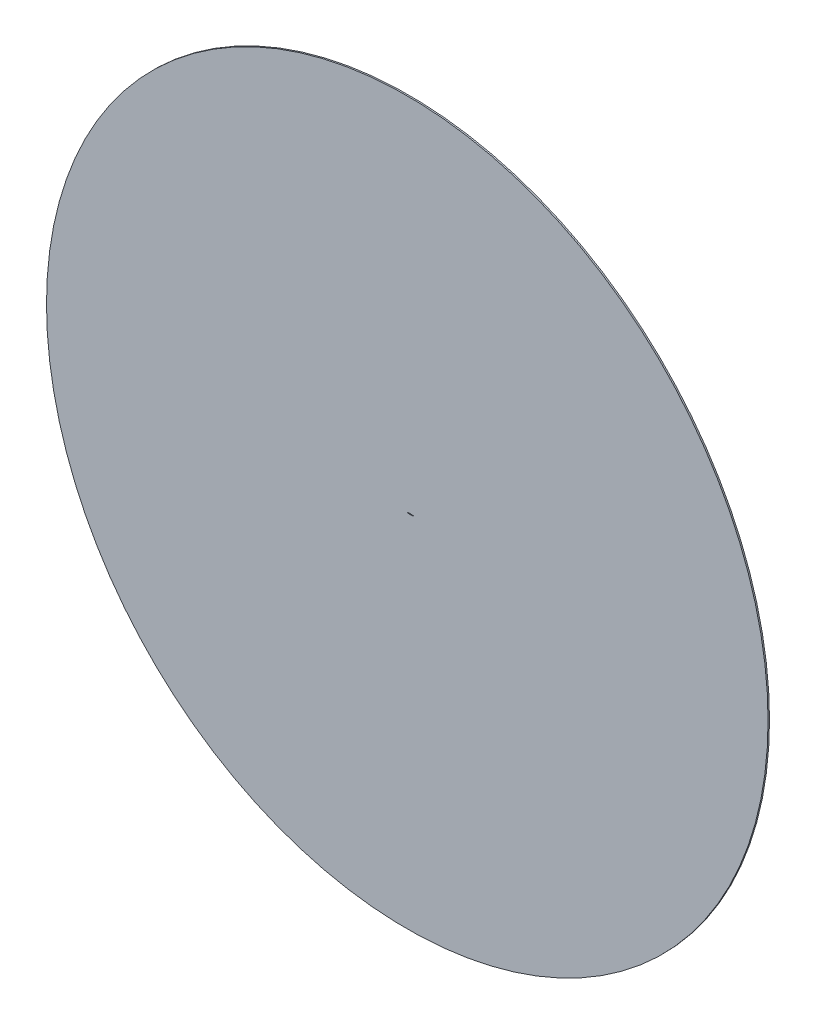
ISO-10303-21;
HEADER;
FILE_DESCRIPTION(('STEP AP214'),'2;1');
FILE_NAME('part.step','',(''),(''),'','','');
FILE_SCHEMA(('AUTOMOTIVE_DESIGN { 1 0 10303 214 1 1 1 1 }'));
ENDSEC;
DATA;
#1=APPLICATION_CONTEXT('core data for automotive mechanical design processes');
#2=APPLICATION_PROTOCOL_DEFINITION('international standard','automotive_design',2000,#1);
#3=PRODUCT_CONTEXT('',#1,'mechanical');
#4=PRODUCT('Part','Part','',(#3));
#5=PRODUCT_RELATED_PRODUCT_CATEGORY('part','',(#4));
#6=PRODUCT_DEFINITION_FORMATION('','',#4);
#7=PRODUCT_DEFINITION_CONTEXT('part definition',#1,'design');
#8=PRODUCT_DEFINITION('design','',#6,#7);
#9=PRODUCT_DEFINITION_SHAPE('','',#8);
#10=(LENGTH_UNIT() NAMED_UNIT(*) SI_UNIT(.MILLI.,.METRE.));
#11=(NAMED_UNIT(*) PLANE_ANGLE_UNIT() SI_UNIT($,.RADIAN.));
#12=(NAMED_UNIT(*) SI_UNIT($,.STERADIAN.) SOLID_ANGLE_UNIT());
#13=UNCERTAINTY_MEASURE_WITH_UNIT(LENGTH_MEASURE(1.E-05),#10,'distance_accuracy_value','');
#14=(GEOMETRIC_REPRESENTATION_CONTEXT(3) GLOBAL_UNCERTAINTY_ASSIGNED_CONTEXT((#13)) GLOBAL_UNIT_ASSIGNED_CONTEXT((#10,
#11,#12)) REPRESENTATION_CONTEXT('',''));
#15=CARTESIAN_POINT('',(0.,0.,0.));
#16=DIRECTION('',(0.,0.,1.));
#17=DIRECTION('',(1.,0.,0.));
#18=AXIS2_PLACEMENT_3D('',#15,#16,#17);
#19=CARTESIAN_POINT('',(0.,0.,121.92));
#20=DIRECTION('',(0.,0.,1.));
#21=DIRECTION('',(1.,0.,0.));
#22=AXIS2_PLACEMENT_3D('',#19,#20,#21);
#23=PLANE('',#22);
#24=CARTESIAN_POINT('',(0.,0.,121.92));
#25=DIRECTION('',(0.,0.,1.));
#26=DIRECTION('',(1.,0.,0.));
#27=AXIS2_PLACEMENT_3D('',#24,#25,#26);
#28=CIRCLE('',#27,30480.);
#29=CARTESIAN_POINT('',(30480.,0.,121.92));
#30=VERTEX_POINT('',#29);
#31=EDGE_CURVE('E10',#30,#30,#28,.T.);
#32=ORIENTED_EDGE('',*,*,#31,.T.);
#33=EDGE_LOOP('',(#32));
#34=FACE_BOUND('',#33,.T.);
#35=CARTESIAN_POINT('',(609.6,0.,121.92));
#36=CARTESIAN_POINT('',(609.6,0.0130104566012491,121.92));
#37=CARTESIAN_POINT('',(609.026600723997,0.0649900751815312,121.92));
#38=CARTESIAN_POINT('',(608.434767900426,0.181226431540429,121.92));
#39=CARTESIAN_POINT('',(606.982031384372,0.374460392824656,121.92));
#40=CARTESIAN_POINT('',(605.170832321289,0.642870250711353,121.92));
#41=CARTESIAN_POINT('',(602.759875483166,0.986789867111129,121.92));
#42=CARTESIAN_POINT('',(599.853785309487,1.40274777429213,121.92));
#43=CARTESIAN_POINT('',(596.420052816498,1.88937961615334,121.92));
#44=CARTESIAN_POINT('',(592.478157132741,2.4453079871152,121.92));
#45=CARTESIAN_POINT('',(588.030463539284,3.06578899853619,121.92));
#46=CARTESIAN_POINT('',(583.086436220917,3.74967155816345,121.92));
#47=CARTESIAN_POINT('',(577.653844904966,4.4919089177736,121.92));
#48=CARTESIAN_POINT('',(571.742714485225,5.29146686524034,121.92));
#49=CARTESIAN_POINT('',(565.363317871176,6.14306525855016,121.92));
#50=CARTESIAN_POINT('',(558.526733426889,7.04351782345002,121.92));
#51=CARTESIAN_POINT('',(551.245154967076,7.98902076977611,121.92));
#52=CARTESIAN_POINT('',(543.531080963299,8.97511952413738,121.92));
#53=CARTESIAN_POINT('',(535.39834803518,9.9995052893117,121.92));
#54=CARTESIAN_POINT('',(526.860963094166,11.0564114791133,121.92));
#55=CARTESIAN_POINT('',(517.933767222701,12.1417835399762,121.92));
#56=CARTESIAN_POINT('',(508.633058212342,13.2534094939068,121.92));
#57=CARTESIAN_POINT('',(498.974520358023,14.3843378403688,121.92));
#58=CARTESIAN_POINT('',(488.975527473465,15.5328714696014,121.92));
#59=CARTESIAN_POINT('',(478.653256963089,16.6941764315264,121.92));
#60=CARTESIAN_POINT('',(468.025945058456,17.8633209757008,121.92));
#61=CARTESIAN_POINT('',(457.112240421421,19.0357667581051,121.92));
#62=CARTESIAN_POINT('',(445.931699122296,20.2096465833874,121.92));
#63=CARTESIAN_POINT('',(434.503313508911,21.3779421217635,121.92));
#64=CARTESIAN_POINT('',(422.847428321855,22.5381760746275,121.92));
#65=CARTESIAN_POINT('',(410.984273272549,23.6850482456446,121.92));
#66=CARTESIAN_POINT('',(398.934895517607,24.8131329223037,121.92));
#67=CARTESIAN_POINT('',(386.720444937814,25.9201631685775,121.92));
#68=CARTESIAN_POINT('',(374.362426443742,26.9990803855691,121.92));
#69=CARTESIAN_POINT('',(361.882333772255,28.0467784576064,121.92));
#70=CARTESIAN_POINT('',(349.302073434196,29.0580285456167,121.92));
#71=CARTESIAN_POINT('',(336.643533947729,30.0270333272432,121.92));
#72=CARTESIAN_POINT('',(323.9291152049,30.9493427134248,121.92));
#73=CARTESIAN_POINT('',(311.181344963931,31.8197227295067,121.92));
#74=CARTESIAN_POINT('',(298.422443522885,32.6341208846026,121.92));
#75=CARTESIAN_POINT('',(285.674590522553,33.384881258023,121.92));
#76=CARTESIAN_POINT('',(272.960120626968,34.0700560065496,121.92));
#77=CARTESIAN_POINT('',(260.30148774547,34.6832866793711,121.92));
#78=CARTESIAN_POINT('',(247.721025079832,35.2189817259111,121.92));
#79=CARTESIAN_POINT('',(235.240711112134,35.6732572044504,121.92));
#80=CARTESIAN_POINT('',(222.882477127997,36.0416368936221,121.92));
#81=CARTESIAN_POINT('',(210.667656569876,36.320169071557,121.92));
#82=CARTESIAN_POINT('',(198.617970937838,36.503920400923,121.92));
#83=CARTESIAN_POINT('',(186.754363143061,36.5908239041067,121.92));
#84=CARTESIAN_POINT('',(175.097954029079,36.575990554921,121.92));
#85=CARTESIAN_POINT('',(163.669045978673,36.459131780211,121.92));
#86=CARTESIAN_POINT('',(152.487788738099,36.2354072011975,121.92));
#87=CARTESIAN_POINT('',(141.573400808221,35.9062635973763,121.92));
#88=CARTESIAN_POINT('',(130.945292405559,35.4671408213348,121.92));
#89=CARTESIAN_POINT('',(120.622029775135,34.9204733380291,121.92));
#90=CARTESIAN_POINT('',(110.621959439198,34.2646057590174,121.92));
#91=CARTESIAN_POINT('',(100.962368246656,33.5002317368583,121.92));
#92=CARTESIAN_POINT('',(91.6601765134049,32.6299789601301,121.92));
#93=CARTESIAN_POINT('',(82.7315541808493,31.6540872878467,121.92));
#94=CARTESIAN_POINT('',(74.1924558830278,30.5756572634052,121.92));
#95=CARTESIAN_POINT('',(66.0575554192351,29.3979394260596,121.92));
#96=CARTESIAN_POINT('',(58.3413184983066,28.1223671881776,121.92));
#97=CARTESIAN_POINT('',(51.0568704189698,26.7548476483737,121.92));
#98=CARTESIAN_POINT('',(44.2170555487253,25.2975481822851,121.92));
#99=CARTESIAN_POINT('',(37.8335029017729,23.7561629133211,121.92));
#100=CARTESIAN_POINT('',(31.9176386513932,22.132931949737,121.92));
#101=CARTESIAN_POINT('',(26.4786305763954,20.4359071090879,121.92));
#102=CARTESIAN_POINT('',(21.5266730137156,18.6661929980101,121.92));
#103=CARTESIAN_POINT('',(17.0689192146321,16.8300633899347,121.92));
#104=CARTESIAN_POINT('',(13.1127046795349,14.9307183485392,121.92));
#105=CARTESIAN_POINT('',(9.6631338936738,12.9729796602536,121.92));
#106=CARTESIAN_POINT('',(6.72559364830512,10.9577256716238,121.92));
#107=CARTESIAN_POINT('',(4.30291585610377,8.88622488664342,121.92));
#108=CARTESIAN_POINT('',(2.39983378850914,6.75579353137347,121.92));
#109=CARTESIAN_POINT('',(1.02186515950936,4.5626304378332,121.92));
#110=CARTESIAN_POINT('',(0.185865427159036,2.30280920654648,121.92));
#111=CARTESIAN_POINT('',(-0.09124321605147,0.,121.92));
#112=CARTESIAN_POINT('',(0.185865427159039,-2.30280920654643,121.92));
#113=CARTESIAN_POINT('',(1.02186515950929,-4.56263043783308,121.92));
#114=CARTESIAN_POINT('',(2.39983378850923,-6.75579353137359,121.92));
#115=CARTESIAN_POINT('',(4.30291585610369,-8.88622488664333,121.92));
#116=CARTESIAN_POINT('',(6.72559364830521,-10.9577256716239,121.92));
#117=CARTESIAN_POINT('',(9.6631338936737,-12.9729796602536,121.92));
#118=CARTESIAN_POINT('',(13.112704679535,-14.9307183485392,121.92));
#119=CARTESIAN_POINT('',(17.068919214632,-16.8300633899347,121.92));
#120=CARTESIAN_POINT('',(21.5266730137157,-18.6661929980102,121.92));
#121=CARTESIAN_POINT('',(26.4786305763953,-20.4359071090879,121.92));
#122=CARTESIAN_POINT('',(31.9176386513933,-22.132931949737,121.92));
#123=CARTESIAN_POINT('',(37.8335029017728,-23.7561629133211,121.92));
#124=CARTESIAN_POINT('',(44.2170555487254,-25.2975481822852,121.92));
#125=CARTESIAN_POINT('',(51.0568704189697,-26.7548476483737,121.92));
#126=CARTESIAN_POINT('',(58.3413184983068,-28.1223671881776,121.92));
#127=CARTESIAN_POINT('',(66.0575554192349,-29.3979394260595,121.92));
#128=CARTESIAN_POINT('',(74.1924558830279,-30.5756572634052,121.92));
#129=CARTESIAN_POINT('',(82.7315541808492,-31.6540872878467,121.92));
#130=CARTESIAN_POINT('',(91.660176513405,-32.6299789601302,121.92));
#131=CARTESIAN_POINT('',(100.962368246656,-33.5002317368583,121.92));
#132=CARTESIAN_POINT('',(110.621959439198,-34.2646057590175,121.92));
#133=CARTESIAN_POINT('',(120.622029775135,-34.9204733380291,121.92));
#134=CARTESIAN_POINT('',(130.945292405559,-35.4671408213348,121.92));
#135=CARTESIAN_POINT('',(141.573400808221,-35.9062635973763,121.92));
#136=CARTESIAN_POINT('',(152.487788738099,-36.2354072011975,121.92));
#137=CARTESIAN_POINT('',(163.669045978673,-36.459131780211,121.92));
#138=CARTESIAN_POINT('',(175.097954029079,-36.5759905549209,121.92));
#139=CARTESIAN_POINT('',(186.754363143061,-36.5908239041067,121.92));
#140=CARTESIAN_POINT('',(198.617970937838,-36.503920400923,121.92));
#141=CARTESIAN_POINT('',(210.667656569876,-36.320169071557,121.92));
#142=CARTESIAN_POINT('',(222.882477127996,-36.0416368936221,121.92));
#143=CARTESIAN_POINT('',(235.240711112134,-35.6732572044504,121.92));
#144=CARTESIAN_POINT('',(247.721025079832,-35.2189817259111,121.92));
#145=CARTESIAN_POINT('',(260.30148774547,-34.6832866793711,121.92));
#146=CARTESIAN_POINT('',(272.960120626968,-34.0700560065496,121.92));
#147=CARTESIAN_POINT('',(285.674590522554,-33.384881258023,121.92));
#148=CARTESIAN_POINT('',(298.422443522885,-32.6341208846026,121.92));
#149=CARTESIAN_POINT('',(311.181344963931,-31.8197227295067,121.92));
#150=CARTESIAN_POINT('',(323.9291152049,-30.9493427134248,121.92));
#151=CARTESIAN_POINT('',(336.643533947729,-30.0270333272432,121.92));
#152=CARTESIAN_POINT('',(349.302073434196,-29.0580285456167,121.92));
#153=CARTESIAN_POINT('',(361.882333772255,-28.0467784576064,121.92));
#154=CARTESIAN_POINT('',(374.362426443742,-26.9990803855691,121.92));
#155=CARTESIAN_POINT('',(386.720444937814,-25.9201631685775,121.92));
#156=CARTESIAN_POINT('',(398.934895517607,-24.8131329223037,121.92));
#157=CARTESIAN_POINT('',(410.984273272549,-23.6850482456446,121.92));
#158=CARTESIAN_POINT('',(422.847428321855,-22.5381760746275,121.92));
#159=CARTESIAN_POINT('',(434.503313508911,-21.3779421217635,121.92));
#160=CARTESIAN_POINT('',(445.931699122296,-20.2096465833874,121.92));
#161=CARTESIAN_POINT('',(457.112240421421,-19.0357667581051,121.92));
#162=CARTESIAN_POINT('',(468.025945058456,-17.8633209757008,121.92));
#163=CARTESIAN_POINT('',(478.653256963089,-16.6941764315264,121.92));
#164=CARTESIAN_POINT('',(488.975527473465,-15.5328714696014,121.92));
#165=CARTESIAN_POINT('',(498.974520358023,-14.3843378403688,121.92));
#166=CARTESIAN_POINT('',(508.633058212342,-13.2534094939068,121.92));
#167=CARTESIAN_POINT('',(517.933767222701,-12.1417835399762,121.92));
#168=CARTESIAN_POINT('',(526.860963094166,-11.0564114791133,121.92));
#169=CARTESIAN_POINT('',(535.39834803518,-9.9995052893117,121.92));
#170=CARTESIAN_POINT('',(543.531080963299,-8.97511952413738,121.92));
#171=CARTESIAN_POINT('',(551.245154967076,-7.98902076977613,121.92));
#172=CARTESIAN_POINT('',(558.52673342689,-7.04351782344999,121.92));
#173=CARTESIAN_POINT('',(565.363317871176,-6.14306525855019,121.92));
#174=CARTESIAN_POINT('',(571.742714485226,-5.29146686524033,121.92));
#175=CARTESIAN_POINT('',(577.653844904966,-4.49190891777361,121.92));
#176=CARTESIAN_POINT('',(583.086436220917,-3.74967155816344,121.92));
#177=CARTESIAN_POINT('',(588.030463539284,-3.06578899853618,121.92));
#178=CARTESIAN_POINT('',(592.478157132742,-2.4453079871152,121.92));
#179=CARTESIAN_POINT('',(596.420052816497,-1.88937961615335,121.92));
#180=CARTESIAN_POINT('',(599.853785309487,-1.40274777429212,121.92));
#181=CARTESIAN_POINT('',(602.759875483166,-0.986789867111129,121.92));
#182=CARTESIAN_POINT('',(605.170832321289,-0.642870250711344,121.92));
#183=CARTESIAN_POINT('',(606.982031384372,-0.374460392824665,121.92));
#184=CARTESIAN_POINT('',(608.434767900426,-0.18122643154044,121.92));
#185=CARTESIAN_POINT('',(609.026600723996,-0.0649900751815252,121.92));
#186=CARTESIAN_POINT('',(609.6,-0.0130104566012454,121.92));
#187=CARTESIAN_POINT('',(609.6,0.,121.92));
#188=B_SPLINE_CURVE_WITH_KNOTS('',3,(#35,#36,#37,#38,#39,#40,#41,#42,#43,#44,#45,#46,#47,#48,
#49,#50,#51,#52,#53,#54,#55,#56,#57,#58,#59,#60,#61,#62,#63,#64,#65,#66,#67,#68,#69,#70,#71,#72,
#73,#74,#75,#76,#77,#78,#79,#80,#81,#82,#83,#84,#85,#86,#87,#88,#89,#90,#91,#92,#93,#94,#95,#96,
#97,#98,#99,#100,#101,#102,#103,#104,#105,#106,#107,#108,#109,#110,#111,#112,#113,#114,#115,
#116,#117,#118,#119,#120,#121,#122,#123,#124,#125,#126,#127,#128,#129,#130,#131,#132,#133,#134,
#135,#136,#137,#138,#139,#140,#141,#142,#143,#144,#145,#146,#147,#148,#149,#150,#151,#152,#153,
#154,#155,#156,#157,#158,#159,#160,#161,#162,#163,#164,#165,#166,#167,#168,#169,#170,#171,#172,
#173,#174,#175,#176,#177,#178,#179,#180,#181,#182,#183,#184,#185,#186,#187),.UNSPECIFIED.,.T.,
.F.,(4,1,1,1,1,1,1,1,1,1,1,1,1,1,1,1,1,1,1,1,1,1,1,1,1,1,1,1,1,1,1,1,1,1,1,1,1,1,1,1,1,1,1,1,1,
1,1,1,1,1,1,1,1,1,1,1,1,1,1,1,1,1,1,1,1,1,1,1,1,1,1,1,1,1,1,1,1,1,1,1,1,1,1,1,1,1,1,1,1,1,1,1,1,
1,1,1,1,1,1,1,1,1,1,1,1,1,1,1,1,1,1,1,1,1,1,1,1,1,1,1,1,1,1,1,1,1,1,1,1,1,1,1,1,1,1,1,1,1,1,1,1,
1,1,1,1,1,1,1,1,1,4),(0.,0.000217527409319114,0.000869069557949156,0.0019535857658787,
0.00346899362156448,0.00541279845327914,0.00778132366559087,0.0105704805840177,
0.0137752106111278,0.0173892810734919,0.0214061139256712,0.0258190002127981,0.0306199115221587,
0.0357996536456854,0.0413491032937559,0.0472591458306939,0.0535176898951425,0.0601147198332137,
0.067038584375729,0.0742757530921175,0.0818147685846495,0.0896410256847508,0.0977411302218903,
0.106101094368963,0.11470590911501,0.123539657073191,0.132587505204979,0.141832961464854,
0.151260183613399,0.160852266970423,0.170592322273226,0.180462588032333,0.190446648941232,
0.200525753603755,0.210683083121863,0.220900825107802,0.231160257408798,0.241443665377053,
0.251732878052951,0.262010189704934,0.272257569523413,0.282457436141302,0.29259128926651,
0.302641712429932,0.312592332187976,0.322424883036641,0.332123630570435,0.341671469802385,
0.351052360701104,0.360250358976082,0.369250607128908,0.378037833816057,0.386598392071256,
0.394917693313771,0.402982298590582,0.410779843570169,0.418298526063883,0.425525783743086,
0.432452085415968,0.439066111684471,0.445358840389342,0.451322797632736,0.456949062427175,
0.462232026972139,0.467166869862672,0.471749135008129,0.475977204654465,0.47985209148139,
0.483377312523538,0.486560001784983,0.489413867466164,0.491960637690815,0.494233583495147,
0.496281470591133,0.49817453634367,0.5,0.50182546365633,0.503718529408868,0.505766416504853,
0.508039362309186,0.510586132533837,0.513439998215018,0.516622687476463,0.520147908518611,
0.524022795345535,0.528250864991872,0.532833130137329,0.537767973027862,0.543050937572825,
0.548677202367265,0.554641159610658,0.560933888315529,0.567547914584033,0.574474216256915,
0.581701473936118,0.589220156429831,0.597017701409418,0.60508230668623,0.613401607928745,
0.621962166183944,0.630749392871093,0.639749641023919,0.648947639298897,0.658328530197616,
0.667876369429565,0.67757511696336,0.687407667812024,0.697358287570068,0.707408710733491,
0.717542563858698,0.727742430476588,0.737989810295066,0.748267121947049,0.758556334622947,
0.768839742591202,0.779099174892198,0.789316916878137,0.799474246396245,0.809553351058768,
0.819537411967668,0.829407677726775,0.839147733029578,0.848739816386601,0.858167038535146,
0.867412494795022,0.87646034292681,0.88529409088499,0.893898905631038,0.90225886977811,
0.91035897431525,0.918185231415351,0.925724246907883,0.932961415624271,0.939885280166787,
0.946482310104858,0.952740854169307,0.958650896706244,0.964200346354315,0.969380088477842,
0.974180999787202,0.978593886074329,0.982610718926508,0.986224789388872,0.989429519415983,
0.992218676334409,0.994587201546721,0.996531006378436,0.998046414234121,0.999130930442051,
0.999782472590681,1.),.UNSPECIFIED.);
#189=CARTESIAN_POINT('',(609.6,0.,121.92));
#190=VERTEX_POINT('',#189);
#191=EDGE_CURVE('E42',#190,#190,#188,.T.);
#192=ORIENTED_EDGE('',*,*,#191,.F.);
#193=EDGE_LOOP('',(#192));
#194=FACE_BOUND('',#193,.T.);
#195=ADVANCED_FACE('F31',(#34,#194),#23,.T.);
#196=CARTESIAN_POINT('',(0.,0.,0.));
#197=DIRECTION('',(0.,0.,1.));
#198=DIRECTION('',(1.,0.,0.));
#199=AXIS2_PLACEMENT_3D('',#196,#197,#198);
#200=PLANE('',#199);
#201=CARTESIAN_POINT('',(0.,0.,0.));
#202=DIRECTION('',(0.,0.,1.));
#203=DIRECTION('',(1.,0.,0.));
#204=AXIS2_PLACEMENT_3D('',#201,#202,#203);
#205=CIRCLE('',#204,30480.);
#206=CARTESIAN_POINT('',(30480.,0.,0.));
#207=VERTEX_POINT('',#206);
#208=EDGE_CURVE('E35',#207,#207,#205,.T.);
#209=ORIENTED_EDGE('',*,*,#208,.F.);
#210=EDGE_LOOP('',(#209));
#211=FACE_BOUND('',#210,.T.);
#212=CARTESIAN_POINT('',(609.6,0.,0.));
#213=CARTESIAN_POINT('',(609.6,0.0130104566012491,0.));
#214=CARTESIAN_POINT('',(609.026600723997,0.0649900751815312,0.));
#215=CARTESIAN_POINT('',(608.434767900426,0.181226431540429,0.));
#216=CARTESIAN_POINT('',(606.982031384372,0.374460392824656,0.));
#217=CARTESIAN_POINT('',(605.170832321289,0.642870250711353,0.));
#218=CARTESIAN_POINT('',(602.759875483166,0.986789867111129,0.));
#219=CARTESIAN_POINT('',(599.853785309487,1.40274777429213,0.));
#220=CARTESIAN_POINT('',(596.420052816498,1.88937961615334,0.));
#221=CARTESIAN_POINT('',(592.478157132741,2.4453079871152,0.));
#222=CARTESIAN_POINT('',(588.030463539284,3.06578899853619,0.));
#223=CARTESIAN_POINT('',(583.086436220917,3.74967155816345,0.));
#224=CARTESIAN_POINT('',(577.653844904966,4.4919089177736,0.));
#225=CARTESIAN_POINT('',(571.742714485225,5.29146686524034,0.));
#226=CARTESIAN_POINT('',(565.363317871176,6.14306525855016,0.));
#227=CARTESIAN_POINT('',(558.526733426889,7.04351782345002,0.));
#228=CARTESIAN_POINT('',(551.245154967076,7.98902076977611,0.));
#229=CARTESIAN_POINT('',(543.531080963299,8.97511952413738,0.));
#230=CARTESIAN_POINT('',(535.39834803518,9.9995052893117,0.));
#231=CARTESIAN_POINT('',(526.860963094166,11.0564114791133,0.));
#232=CARTESIAN_POINT('',(517.933767222701,12.1417835399762,0.));
#233=CARTESIAN_POINT('',(508.633058212342,13.2534094939068,0.));
#234=CARTESIAN_POINT('',(498.974520358023,14.3843378403688,0.));
#235=CARTESIAN_POINT('',(488.975527473465,15.5328714696014,0.));
#236=CARTESIAN_POINT('',(478.653256963089,16.6941764315264,0.));
#237=CARTESIAN_POINT('',(468.025945058456,17.8633209757008,0.));
#238=CARTESIAN_POINT('',(457.112240421421,19.0357667581051,0.));
#239=CARTESIAN_POINT('',(445.931699122296,20.2096465833874,0.));
#240=CARTESIAN_POINT('',(434.503313508911,21.3779421217635,0.));
#241=CARTESIAN_POINT('',(422.847428321855,22.5381760746275,0.));
#242=CARTESIAN_POINT('',(410.984273272549,23.6850482456446,0.));
#243=CARTESIAN_POINT('',(398.934895517607,24.8131329223037,0.));
#244=CARTESIAN_POINT('',(386.720444937814,25.9201631685775,0.));
#245=CARTESIAN_POINT('',(374.362426443742,26.9990803855691,0.));
#246=CARTESIAN_POINT('',(361.882333772255,28.0467784576064,0.));
#247=CARTESIAN_POINT('',(349.302073434196,29.0580285456167,0.));
#248=CARTESIAN_POINT('',(336.643533947729,30.0270333272432,0.));
#249=CARTESIAN_POINT('',(323.9291152049,30.9493427134248,0.));
#250=CARTESIAN_POINT('',(311.181344963931,31.8197227295067,0.));
#251=CARTESIAN_POINT('',(298.422443522885,32.6341208846026,0.));
#252=CARTESIAN_POINT('',(285.674590522553,33.384881258023,0.));
#253=CARTESIAN_POINT('',(272.960120626968,34.0700560065496,0.));
#254=CARTESIAN_POINT('',(260.30148774547,34.6832866793711,0.));
#255=CARTESIAN_POINT('',(247.721025079832,35.2189817259111,0.));
#256=CARTESIAN_POINT('',(235.240711112134,35.6732572044504,0.));
#257=CARTESIAN_POINT('',(222.882477127997,36.0416368936221,0.));
#258=CARTESIAN_POINT('',(210.667656569876,36.320169071557,0.));
#259=CARTESIAN_POINT('',(198.617970937838,36.503920400923,0.));
#260=CARTESIAN_POINT('',(186.754363143061,36.5908239041067,0.));
#261=CARTESIAN_POINT('',(175.097954029079,36.575990554921,0.));
#262=CARTESIAN_POINT('',(163.669045978673,36.459131780211,0.));
#263=CARTESIAN_POINT('',(152.487788738099,36.2354072011975,0.));
#264=CARTESIAN_POINT('',(141.573400808221,35.9062635973763,0.));
#265=CARTESIAN_POINT('',(130.945292405559,35.4671408213348,0.));
#266=CARTESIAN_POINT('',(120.622029775135,34.9204733380291,0.));
#267=CARTESIAN_POINT('',(110.621959439198,34.2646057590174,0.));
#268=CARTESIAN_POINT('',(100.962368246656,33.5002317368583,0.));
#269=CARTESIAN_POINT('',(91.6601765134049,32.6299789601301,0.));
#270=CARTESIAN_POINT('',(82.7315541808493,31.6540872878467,0.));
#271=CARTESIAN_POINT('',(74.1924558830278,30.5756572634052,0.));
#272=CARTESIAN_POINT('',(66.0575554192351,29.3979394260596,0.));
#273=CARTESIAN_POINT('',(58.3413184983066,28.1223671881776,0.));
#274=CARTESIAN_POINT('',(51.0568704189698,26.7548476483737,0.));
#275=CARTESIAN_POINT('',(44.2170555487253,25.2975481822851,0.));
#276=CARTESIAN_POINT('',(37.8335029017729,23.7561629133211,0.));
#277=CARTESIAN_POINT('',(31.9176386513932,22.132931949737,0.));
#278=CARTESIAN_POINT('',(26.4786305763954,20.4359071090879,0.));
#279=CARTESIAN_POINT('',(21.5266730137156,18.6661929980101,0.));
#280=CARTESIAN_POINT('',(17.0689192146321,16.8300633899347,0.));
#281=CARTESIAN_POINT('',(13.1127046795349,14.9307183485392,0.));
#282=CARTESIAN_POINT('',(9.6631338936738,12.9729796602536,0.));
#283=CARTESIAN_POINT('',(6.72559364830512,10.9577256716238,0.));
#284=CARTESIAN_POINT('',(4.30291585610377,8.88622488664342,0.));
#285=CARTESIAN_POINT('',(2.39983378850914,6.75579353137347,0.));
#286=CARTESIAN_POINT('',(1.02186515950936,4.5626304378332,0.));
#287=CARTESIAN_POINT('',(0.185865427159036,2.30280920654648,0.));
#288=CARTESIAN_POINT('',(-0.09124321605147,0.,0.));
#289=CARTESIAN_POINT('',(0.185865427159039,-2.30280920654643,0.));
#290=CARTESIAN_POINT('',(1.02186515950929,-4.56263043783308,0.));
#291=CARTESIAN_POINT('',(2.39983378850923,-6.75579353137359,0.));
#292=CARTESIAN_POINT('',(4.30291585610369,-8.88622488664333,0.));
#293=CARTESIAN_POINT('',(6.72559364830521,-10.9577256716239,0.));
#294=CARTESIAN_POINT('',(9.6631338936737,-12.9729796602536,0.));
#295=CARTESIAN_POINT('',(13.112704679535,-14.9307183485392,0.));
#296=CARTESIAN_POINT('',(17.068919214632,-16.8300633899347,0.));
#297=CARTESIAN_POINT('',(21.5266730137157,-18.6661929980102,0.));
#298=CARTESIAN_POINT('',(26.4786305763953,-20.4359071090879,0.));
#299=CARTESIAN_POINT('',(31.9176386513933,-22.132931949737,0.));
#300=CARTESIAN_POINT('',(37.8335029017728,-23.7561629133211,0.));
#301=CARTESIAN_POINT('',(44.2170555487254,-25.2975481822852,0.));
#302=CARTESIAN_POINT('',(51.0568704189697,-26.7548476483737,0.));
#303=CARTESIAN_POINT('',(58.3413184983068,-28.1223671881776,0.));
#304=CARTESIAN_POINT('',(66.0575554192349,-29.3979394260595,0.));
#305=CARTESIAN_POINT('',(74.1924558830279,-30.5756572634052,0.));
#306=CARTESIAN_POINT('',(82.7315541808492,-31.6540872878467,0.));
#307=CARTESIAN_POINT('',(91.660176513405,-32.6299789601302,0.));
#308=CARTESIAN_POINT('',(100.962368246656,-33.5002317368583,0.));
#309=CARTESIAN_POINT('',(110.621959439198,-34.2646057590175,0.));
#310=CARTESIAN_POINT('',(120.622029775135,-34.9204733380291,0.));
#311=CARTESIAN_POINT('',(130.945292405559,-35.4671408213348,0.));
#312=CARTESIAN_POINT('',(141.573400808221,-35.9062635973763,0.));
#313=CARTESIAN_POINT('',(152.487788738099,-36.2354072011975,0.));
#314=CARTESIAN_POINT('',(163.669045978673,-36.459131780211,0.));
#315=CARTESIAN_POINT('',(175.097954029079,-36.5759905549209,0.));
#316=CARTESIAN_POINT('',(186.754363143061,-36.5908239041067,0.));
#317=CARTESIAN_POINT('',(198.617970937838,-36.503920400923,0.));
#318=CARTESIAN_POINT('',(210.667656569876,-36.320169071557,0.));
#319=CARTESIAN_POINT('',(222.882477127996,-36.0416368936221,0.));
#320=CARTESIAN_POINT('',(235.240711112134,-35.6732572044504,0.));
#321=CARTESIAN_POINT('',(247.721025079832,-35.2189817259111,0.));
#322=CARTESIAN_POINT('',(260.30148774547,-34.6832866793711,0.));
#323=CARTESIAN_POINT('',(272.960120626968,-34.0700560065496,0.));
#324=CARTESIAN_POINT('',(285.674590522554,-33.384881258023,0.));
#325=CARTESIAN_POINT('',(298.422443522885,-32.6341208846026,0.));
#326=CARTESIAN_POINT('',(311.181344963931,-31.8197227295067,0.));
#327=CARTESIAN_POINT('',(323.9291152049,-30.9493427134248,0.));
#328=CARTESIAN_POINT('',(336.643533947729,-30.0270333272432,0.));
#329=CARTESIAN_POINT('',(349.302073434196,-29.0580285456167,0.));
#330=CARTESIAN_POINT('',(361.882333772255,-28.0467784576064,0.));
#331=CARTESIAN_POINT('',(374.362426443742,-26.9990803855691,0.));
#332=CARTESIAN_POINT('',(386.720444937814,-25.9201631685775,0.));
#333=CARTESIAN_POINT('',(398.934895517607,-24.8131329223037,0.));
#334=CARTESIAN_POINT('',(410.984273272549,-23.6850482456446,0.));
#335=CARTESIAN_POINT('',(422.847428321855,-22.5381760746275,0.));
#336=CARTESIAN_POINT('',(434.503313508911,-21.3779421217635,0.));
#337=CARTESIAN_POINT('',(445.931699122296,-20.2096465833874,0.));
#338=CARTESIAN_POINT('',(457.112240421421,-19.0357667581051,0.));
#339=CARTESIAN_POINT('',(468.025945058456,-17.8633209757008,0.));
#340=CARTESIAN_POINT('',(478.653256963089,-16.6941764315264,0.));
#341=CARTESIAN_POINT('',(488.975527473465,-15.5328714696014,0.));
#342=CARTESIAN_POINT('',(498.974520358023,-14.3843378403688,0.));
#343=CARTESIAN_POINT('',(508.633058212342,-13.2534094939068,0.));
#344=CARTESIAN_POINT('',(517.933767222701,-12.1417835399762,0.));
#345=CARTESIAN_POINT('',(526.860963094166,-11.0564114791133,0.));
#346=CARTESIAN_POINT('',(535.39834803518,-9.9995052893117,0.));
#347=CARTESIAN_POINT('',(543.531080963299,-8.97511952413738,0.));
#348=CARTESIAN_POINT('',(551.245154967076,-7.98902076977613,0.));
#349=CARTESIAN_POINT('',(558.52673342689,-7.04351782344999,0.));
#350=CARTESIAN_POINT('',(565.363317871176,-6.14306525855019,0.));
#351=CARTESIAN_POINT('',(571.742714485226,-5.29146686524033,0.));
#352=CARTESIAN_POINT('',(577.653844904966,-4.49190891777361,0.));
#353=CARTESIAN_POINT('',(583.086436220917,-3.74967155816344,0.));
#354=CARTESIAN_POINT('',(588.030463539284,-3.06578899853618,0.));
#355=CARTESIAN_POINT('',(592.478157132742,-2.4453079871152,0.));
#356=CARTESIAN_POINT('',(596.420052816497,-1.88937961615335,0.));
#357=CARTESIAN_POINT('',(599.853785309487,-1.40274777429212,0.));
#358=CARTESIAN_POINT('',(602.759875483166,-0.986789867111129,0.));
#359=CARTESIAN_POINT('',(605.170832321289,-0.642870250711344,0.));
#360=CARTESIAN_POINT('',(606.982031384372,-0.374460392824665,0.));
#361=CARTESIAN_POINT('',(608.434767900426,-0.18122643154044,0.));
#362=CARTESIAN_POINT('',(609.026600723996,-0.0649900751815252,0.));
#363=CARTESIAN_POINT('',(609.6,-0.0130104566012454,0.));
#364=CARTESIAN_POINT('',(609.6,0.,0.));
#365=B_SPLINE_CURVE_WITH_KNOTS('',3,(#212,#213,#214,#215,#216,#217,#218,#219,#220,#221,#222,
#223,#224,#225,#226,#227,#228,#229,#230,#231,#232,#233,#234,#235,#236,#237,#238,#239,#240,#241,
#242,#243,#244,#245,#246,#247,#248,#249,#250,#251,#252,#253,#254,#255,#256,#257,#258,#259,#260,
#261,#262,#263,#264,#265,#266,#267,#268,#269,#270,#271,#272,#273,#274,#275,#276,#277,#278,#279,
#280,#281,#282,#283,#284,#285,#286,#287,#288,#289,#290,#291,#292,#293,#294,#295,#296,#297,#298,
#299,#300,#301,#302,#303,#304,#305,#306,#307,#308,#309,#310,#311,#312,#313,#314,#315,#316,#317,
#318,#319,#320,#321,#322,#323,#324,#325,#326,#327,#328,#329,#330,#331,#332,#333,#334,#335,#336,
#337,#338,#339,#340,#341,#342,#343,#344,#345,#346,#347,#348,#349,#350,#351,#352,#353,#354,#355,
#356,#357,#358,#359,#360,#361,#362,#363,#364),.UNSPECIFIED.,.T.,.F.,(4,1,1,1,1,1,1,1,1,1,1,1,1,
1,1,1,1,1,1,1,1,1,1,1,1,1,1,1,1,1,1,1,1,1,1,1,1,1,1,1,1,1,1,1,1,1,1,1,1,1,1,1,1,1,1,1,1,1,1,1,1,
1,1,1,1,1,1,1,1,1,1,1,1,1,1,1,1,1,1,1,1,1,1,1,1,1,1,1,1,1,1,1,1,1,1,1,1,1,1,1,1,1,1,1,1,1,1,1,1,
1,1,1,1,1,1,1,1,1,1,1,1,1,1,1,1,1,1,1,1,1,1,1,1,1,1,1,1,1,1,1,1,1,1,1,1,1,1,1,1,1,4),(0.,
0.000217527409319114,0.000869069557949156,0.0019535857658787,0.00346899362156448,
0.00541279845327914,0.00778132366559087,0.0105704805840177,0.0137752106111278,
0.0173892810734919,0.0214061139256712,0.0258190002127981,0.0306199115221587,0.0357996536456854,
0.0413491032937559,0.0472591458306939,0.0535176898951425,0.0601147198332137,0.067038584375729,
0.0742757530921175,0.0818147685846495,0.0896410256847508,0.0977411302218903,0.106101094368963,
0.11470590911501,0.123539657073191,0.132587505204979,0.141832961464854,0.151260183613399,
0.160852266970423,0.170592322273226,0.180462588032333,0.190446648941232,0.200525753603755,
0.210683083121863,0.220900825107802,0.231160257408798,0.241443665377053,0.251732878052951,
0.262010189704934,0.272257569523413,0.282457436141302,0.29259128926651,0.302641712429932,
0.312592332187976,0.322424883036641,0.332123630570435,0.341671469802385,0.351052360701104,
0.360250358976082,0.369250607128908,0.378037833816057,0.386598392071256,0.394917693313771,
0.402982298590582,0.410779843570169,0.418298526063883,0.425525783743086,0.432452085415968,
0.439066111684471,0.445358840389342,0.451322797632736,0.456949062427175,0.462232026972139,
0.467166869862672,0.471749135008129,0.475977204654465,0.47985209148139,0.483377312523538,
0.486560001784983,0.489413867466164,0.491960637690815,0.494233583495147,0.496281470591133,
0.49817453634367,0.5,0.50182546365633,0.503718529408868,0.505766416504853,0.508039362309186,
0.510586132533837,0.513439998215018,0.516622687476463,0.520147908518611,0.524022795345535,
0.528250864991872,0.532833130137329,0.537767973027862,0.543050937572825,0.548677202367265,
0.554641159610658,0.560933888315529,0.567547914584033,0.574474216256915,0.581701473936118,
0.589220156429831,0.597017701409418,0.60508230668623,0.613401607928745,0.621962166183944,
0.630749392871093,0.639749641023919,0.648947639298897,0.658328530197616,0.667876369429565,
0.67757511696336,0.687407667812024,0.697358287570068,0.707408710733491,0.717542563858698,
0.727742430476588,0.737989810295066,0.748267121947049,0.758556334622947,0.768839742591202,
0.779099174892198,0.789316916878137,0.799474246396245,0.809553351058768,0.819537411967668,
0.829407677726775,0.839147733029578,0.848739816386601,0.858167038535146,0.867412494795022,
0.87646034292681,0.88529409088499,0.893898905631038,0.90225886977811,0.91035897431525,
0.918185231415351,0.925724246907883,0.932961415624271,0.939885280166787,0.946482310104858,
0.952740854169307,0.958650896706244,0.964200346354315,0.969380088477842,0.974180999787202,
0.978593886074329,0.982610718926508,0.986224789388872,0.989429519415983,0.992218676334409,
0.994587201546721,0.996531006378436,0.998046414234121,0.999130930442051,0.999782472590681,1.),.UNSPECIFIED.);
#366=CARTESIAN_POINT('',(609.6,0.,0.));
#367=VERTEX_POINT('',#366);
#368=EDGE_CURVE('E44',#367,#367,#365,.T.);
#369=ORIENTED_EDGE('',*,*,#368,.T.);
#370=EDGE_LOOP('',(#369));
#371=FACE_BOUND('',#370,.T.);
#372=ADVANCED_FACE('F65',(#211,#371),#200,.F.);
#373=CARTESIAN_POINT('',(0.,0.,121.92));
#374=DIRECTION('',(0.,0.,-1.));
#375=DIRECTION('',(-1.,0.,0.));
#376=AXIS2_PLACEMENT_3D('',#373,#374,#375);
#377=CYLINDRICAL_SURFACE('',#376,30480.);
#378=ORIENTED_EDGE('',*,*,#31,.F.);
#379=EDGE_LOOP('',(#378));
#380=FACE_BOUND('',#379,.T.);
#381=ORIENTED_EDGE('',*,*,#208,.T.);
#382=EDGE_LOOP('',(#381));
#383=FACE_BOUND('',#382,.T.);
#384=ADVANCED_FACE('F33',(#380,#383),#377,.T.);
#385=DIRECTION('',(0.,0.,-1.));
#386=VECTOR('',#385,1.);
#387=SURFACE_OF_LINEAR_EXTRUSION('',#188,#386);
#388=ORIENTED_EDGE('',*,*,#191,.T.);
#389=EDGE_LOOP('',(#388));
#390=FACE_BOUND('',#389,.T.);
#391=ORIENTED_EDGE('',*,*,#368,.F.);
#392=EDGE_LOOP('',(#391));
#393=FACE_BOUND('',#392,.T.);
#394=ADVANCED_FACE('F60',(#390,#393),#387,.T.);
#395=CLOSED_SHELL('',(#195,#372,#384,#394));
#396=MANIFOLD_SOLID_BREP('B2',#395);
#397=ADVANCED_BREP_SHAPE_REPRESENTATION('',(#18,#396),#14);
#398=SHAPE_DEFINITION_REPRESENTATION(#9,#397);
ENDSEC;
END-ISO-10303-21;
